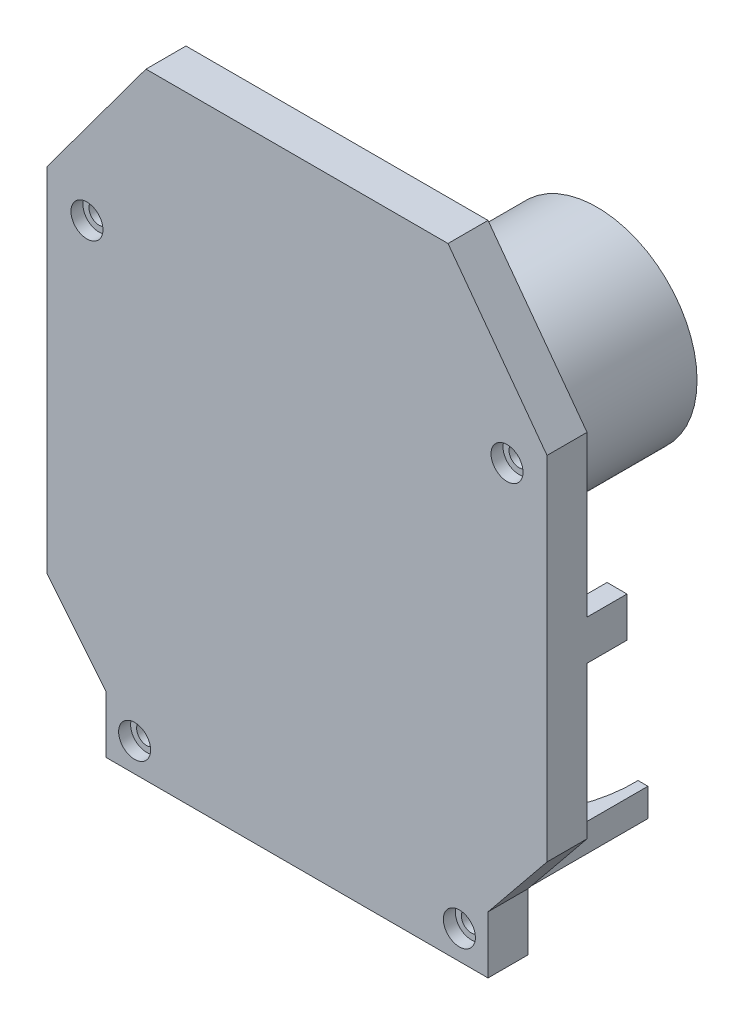
ISO-10303-21;
HEADER;
FILE_DESCRIPTION(('STEP AP214'),'2;1');
FILE_NAME('part.step','',(''),(''),'','','');
FILE_SCHEMA(('AUTOMOTIVE_DESIGN { 1 0 10303 214 1 1 1 1 }'));
ENDSEC;
DATA;
#1=APPLICATION_CONTEXT('core data for automotive mechanical design processes');
#2=APPLICATION_PROTOCOL_DEFINITION('international standard','automotive_design',2000,#1);
#3=PRODUCT_CONTEXT('',#1,'mechanical');
#4=PRODUCT('Part','Part','',(#3));
#5=PRODUCT_RELATED_PRODUCT_CATEGORY('part','',(#4));
#6=PRODUCT_DEFINITION_FORMATION('','',#4);
#7=PRODUCT_DEFINITION_CONTEXT('part definition',#1,'design');
#8=PRODUCT_DEFINITION('design','',#6,#7);
#9=PRODUCT_DEFINITION_SHAPE('','',#8);
#10=(LENGTH_UNIT() NAMED_UNIT(*) SI_UNIT(.MILLI.,.METRE.));
#11=(NAMED_UNIT(*) PLANE_ANGLE_UNIT() SI_UNIT($,.RADIAN.));
#12=(NAMED_UNIT(*) SI_UNIT($,.STERADIAN.) SOLID_ANGLE_UNIT());
#13=UNCERTAINTY_MEASURE_WITH_UNIT(LENGTH_MEASURE(1.E-05),#10,'distance_accuracy_value','');
#14=(GEOMETRIC_REPRESENTATION_CONTEXT(3) GLOBAL_UNCERTAINTY_ASSIGNED_CONTEXT((#13)) GLOBAL_UNIT_ASSIGNED_CONTEXT((#10,
#11,#12)) REPRESENTATION_CONTEXT('',''));
#15=CARTESIAN_POINT('',(0.,0.,0.));
#16=DIRECTION('',(0.,0.,1.));
#17=DIRECTION('',(1.,0.,0.));
#18=AXIS2_PLACEMENT_3D('',#15,#16,#17);
#19=CARTESIAN_POINT('',(-62.5,-48.,40.));
#20=DIRECTION('',(0.776503226970007,0.630113274344514,0.));
#21=DIRECTION('',(-0.630113274344514,0.776503226970007,0.));
#22=AXIS2_PLACEMENT_3D('',#19,#20,#21);
#23=PLANE('',#22);
#24=DIRECTION('',(0.630113274344514,-0.776503226970008,0.));
#25=VECTOR('',#24,1.);
#26=CARTESIAN_POINT('',(-62.5,-48.,30.));
#27=LINE('',#26,#25);
#28=CARTESIAN_POINT('',(-62.5,-48.,30.));
#29=VERTEX_POINT('',#28);
#30=CARTESIAN_POINT('',(-47.75,-66.1767676767677,30.));
#31=VERTEX_POINT('',#30);
#32=EDGE_CURVE('E1730',#29,#31,#27,.T.);
#33=ORIENTED_EDGE('',*,*,#32,.T.);
#34=DIRECTION('',(0.,0.,-1.));
#35=VECTOR('',#34,1.);
#36=CARTESIAN_POINT('',(-47.75,-66.1767676767677,40.));
#37=LINE('',#36,#35);
#38=CARTESIAN_POINT('',(-47.75,-66.1767676767677,40.));
#39=VERTEX_POINT('',#38);
#40=EDGE_CURVE('E1707',#39,#31,#37,.T.);
#41=ORIENTED_EDGE('',*,*,#40,.F.);
#42=DIRECTION('',(0.630113274344514,-0.776503226970008,0.));
#43=VECTOR('',#42,1.);
#44=CARTESIAN_POINT('',(-62.5,-48.,40.));
#45=LINE('',#44,#43);
#46=CARTESIAN_POINT('',(-62.5,-48.,40.));
#47=VERTEX_POINT('',#46);
#48=EDGE_CURVE('E1706',#47,#39,#45,.T.);
#49=ORIENTED_EDGE('',*,*,#48,.F.);
#50=DIRECTION('',(0.,0.,-1.));
#51=VECTOR('',#50,1.);
#52=CARTESIAN_POINT('',(-62.5,-48.,40.));
#53=LINE('',#52,#51);
#54=EDGE_CURVE('E1741',#47,#29,#53,.T.);
#55=ORIENTED_EDGE('',*,*,#54,.T.);
#56=EDGE_LOOP('',(#33,#41,#49,#55));
#57=FACE_BOUND('',#56,.T.);
#58=ADVANCED_FACE('F1522',(#57),#23,.F.);
#59=CARTESIAN_POINT('',(0.,-78.5,0.));
#60=DIRECTION('',(0.,-1.,0.));
#61=DIRECTION('',(0.,0.,-1.));
#62=AXIS2_PLACEMENT_3D('',#59,#60,#61);
#63=PLANE('',#62);
#64=DIRECTION('',(0.,0.,1.));
#65=VECTOR('',#64,1.);
#66=CARTESIAN_POINT('',(35.2274506838568,-78.5,-12.5));
#67=LINE('',#66,#65);
#68=CARTESIAN_POINT('',(35.2274506838568,-78.5,-12.5));
#69=VERTEX_POINT('',#68);
#70=CARTESIAN_POINT('',(35.2274506838568,-78.5,30.));
#71=VERTEX_POINT('',#70);
#72=EDGE_CURVE('E1788',#69,#71,#67,.T.);
#73=ORIENTED_EDGE('',*,*,#72,.T.);
#74=DIRECTION('',(1.,0.,0.));
#75=VECTOR('',#74,1.);
#76=CARTESIAN_POINT('',(-47.75,-78.5,30.));
#77=LINE('',#76,#75);
#78=CARTESIAN_POINT('',(-35.2274506838568,-78.5,30.));
#79=VERTEX_POINT('',#78);
#80=EDGE_CURVE('E1711',#79,#71,#77,.T.);
#81=ORIENTED_EDGE('',*,*,#80,.F.);
#82=DIRECTION('',(0.,0.,-1.));
#83=VECTOR('',#82,1.);
#84=CARTESIAN_POINT('',(-35.2274506838568,-78.5,30.));
#85=LINE('',#84,#83);
#86=CARTESIAN_POINT('',(-35.2274506838568,-78.5,-12.5));
#87=VERTEX_POINT('',#86);
#88=EDGE_CURVE('E1792',#79,#87,#85,.T.);
#89=ORIENTED_EDGE('',*,*,#88,.T.);
#90=DIRECTION('',(1.,0.,0.));
#91=VECTOR('',#90,1.);
#92=CARTESIAN_POINT('',(-32.75,-78.5,-12.5));
#93=LINE('',#92,#91);
#94=CARTESIAN_POINT('',(-32.75,-78.5,-12.5));
#95=VERTEX_POINT('',#94);
#96=EDGE_CURVE('E1785',#87,#95,#93,.T.);
#97=ORIENTED_EDGE('',*,*,#96,.T.);
#98=CARTESIAN_POINT('',(0.,-78.5,-11.5148148148148));
#99=DIRECTION('',(0.,-1.,0.));
#100=DIRECTION('',(0.,0.,-1.));
#101=AXIS2_PLACEMENT_3D('',#98,#99,#100);
#102=CIRCLE('',#101,32.7648148148148);
#103=CARTESIAN_POINT('',(32.75,-78.5,-12.5));
#104=VERTEX_POINT('',#103);
#105=EDGE_CURVE('E1755',#104,#95,#102,.T.);
#106=ORIENTED_EDGE('',*,*,#105,.F.);
#107=DIRECTION('',(1.,0.,0.));
#108=VECTOR('',#107,1.);
#109=CARTESIAN_POINT('',(35.2274506838568,-78.5,-12.5));
#110=LINE('',#109,#108);
#111=EDGE_CURVE('E1780',#104,#69,#110,.T.);
#112=ORIENTED_EDGE('',*,*,#111,.T.);
#113=EDGE_LOOP('',(#73,#81,#89,#97,#106,#112));
#114=FACE_BOUND('',#113,.T.);
#115=ADVANCED_FACE('F2031',(#114),#63,.T.);
#116=CARTESIAN_POINT('',(0.,0.,-12.5));
#117=DIRECTION('',(0.,0.,1.));
#118=DIRECTION('',(1.,0.,0.));
#119=AXIS2_PLACEMENT_3D('',#116,#117,#118);
#120=PLANE('',#119);
#121=DIRECTION('',(-1.,0.,0.));
#122=VECTOR('',#121,1.);
#123=CARTESIAN_POINT('',(-32.75,-71.5,-12.5));
#124=LINE('',#123,#122);
#125=CARTESIAN_POINT('',(-32.75,-71.5000000000001,-12.5));
#126=VERTEX_POINT('',#125);
#127=CARTESIAN_POINT('',(-35.2274506838568,-71.5,-12.5));
#128=VERTEX_POINT('',#127);
#129=EDGE_CURVE('E1753',#126,#128,#124,.T.);
#130=ORIENTED_EDGE('',*,*,#129,.F.);
#131=DIRECTION('',(0.,-1.,0.));
#132=VECTOR('',#131,1.);
#133=CARTESIAN_POINT('',(-32.75,-68.5,-12.5));
#134=LINE('',#133,#132);
#135=EDGE_CURVE('E1828',#126,#95,#134,.T.);
#136=ORIENTED_EDGE('',*,*,#135,.T.);
#137=ORIENTED_EDGE('',*,*,#96,.F.);
#138=DIRECTION('',(0.,-1.,0.));
#139=VECTOR('',#138,1.);
#140=CARTESIAN_POINT('',(-35.2274506838568,-68.5,-12.5));
#141=LINE('',#140,#139);
#142=EDGE_CURVE('E1831',#128,#87,#141,.T.);
#143=ORIENTED_EDGE('',*,*,#142,.F.);
#144=EDGE_LOOP('',(#130,#136,#137,#143));
#145=FACE_BOUND('',#144,.T.);
#146=ADVANCED_FACE('F2039',(#145),#120,.F.);
#147=DIRECTION('',(-1.,0.,0.));
#148=VECTOR('',#147,1.);
#149=CARTESIAN_POINT('',(35.2274506838568,-71.5,-12.5));
#150=LINE('',#149,#148);
#151=CARTESIAN_POINT('',(35.2274506838568,-71.5,-12.5));
#152=VERTEX_POINT('',#151);
#153=CARTESIAN_POINT('',(32.75,-71.5,-12.5));
#154=VERTEX_POINT('',#153);
#155=EDGE_CURVE('E1547',#152,#154,#150,.T.);
#156=ORIENTED_EDGE('',*,*,#155,.F.);
#157=DIRECTION('',(0.,1.,0.));
#158=VECTOR('',#157,1.);
#159=CARTESIAN_POINT('',(35.2274506838568,-73.5,-12.5));
#160=LINE('',#159,#158);
#161=EDGE_CURVE('E2250',#69,#152,#160,.T.);
#162=ORIENTED_EDGE('',*,*,#161,.F.);
#163=ORIENTED_EDGE('',*,*,#111,.F.);
#164=DIRECTION('',(0.,-1.,0.));
#165=VECTOR('',#164,1.);
#166=CARTESIAN_POINT('',(32.75,-68.5,-12.5));
#167=LINE('',#166,#165);
#168=EDGE_CURVE('E1822',#154,#104,#167,.T.);
#169=ORIENTED_EDGE('',*,*,#168,.F.);
#170=EDGE_LOOP('',(#156,#162,#163,#169));
#171=FACE_BOUND('',#170,.T.);
#172=ADVANCED_FACE('F2082',(#171),#120,.F.);
#173=CARTESIAN_POINT('',(-35.2274506838568,-68.5,30.));
#174=DIRECTION('',(1.,0.,0.));
#175=DIRECTION('',(0.,1.,0.));
#176=AXIS2_PLACEMENT_3D('',#173,#174,#175);
#177=PLANE('',#176);
#178=DIRECTION('',(0.,0.,-1.));
#179=VECTOR('',#178,1.);
#180=CARTESIAN_POINT('',(-35.2274506838568,-71.5,30.));
#181=LINE('',#180,#179);
#182=CARTESIAN_POINT('',(-35.2274506838568,-71.5,30.));
#183=VERTEX_POINT('',#182);
#184=EDGE_CURVE('E1756',#183,#128,#181,.T.);
#185=ORIENTED_EDGE('',*,*,#184,.T.);
#186=ORIENTED_EDGE('',*,*,#142,.T.);
#187=ORIENTED_EDGE('',*,*,#88,.F.);
#188=DIRECTION('',(0.,-1.,0.));
#189=VECTOR('',#188,1.);
#190=CARTESIAN_POINT('',(-35.2274506838568,-68.5,30.));
#191=LINE('',#190,#189);
#192=EDGE_CURVE('E1834',#183,#79,#191,.T.);
#193=ORIENTED_EDGE('',*,*,#192,.F.);
#194=EDGE_LOOP('',(#185,#186,#187,#193));
#195=FACE_BOUND('',#194,.T.);
#196=ADVANCED_FACE('F2079',(#195),#177,.F.);
#197=CARTESIAN_POINT('',(35.2274506838568,-73.5,30.));
#198=DIRECTION('',(-1.,0.,0.));
#199=DIRECTION('',(0.,0.,1.));
#200=AXIS2_PLACEMENT_3D('',#197,#198,#199);
#201=PLANE('',#200);
#202=DIRECTION('',(0.,0.,1.));
#203=VECTOR('',#202,1.);
#204=CARTESIAN_POINT('',(35.2274506838568,-71.5,-12.5));
#205=LINE('',#204,#203);
#206=CARTESIAN_POINT('',(35.2274506838568,-71.5,30.));
#207=VERTEX_POINT('',#206);
#208=EDGE_CURVE('E1768',#152,#207,#205,.T.);
#209=ORIENTED_EDGE('',*,*,#208,.T.);
#210=DIRECTION('',(0.,1.,0.));
#211=VECTOR('',#210,1.);
#212=CARTESIAN_POINT('',(35.2274506838568,-73.5,30.));
#213=LINE('',#212,#211);
#214=EDGE_CURVE('E1865',#71,#207,#213,.T.);
#215=ORIENTED_EDGE('',*,*,#214,.F.);
#216=ORIENTED_EDGE('',*,*,#72,.F.);
#217=ORIENTED_EDGE('',*,*,#161,.T.);
#218=EDGE_LOOP('',(#209,#215,#216,#217));
#219=FACE_BOUND('',#218,.T.);
#220=ADVANCED_FACE('F2052',(#219),#201,.F.);
#221=CARTESIAN_POINT('',(0.,-78.5,-11.5148148148148));
#222=DIRECTION('',(0.,1.,0.));
#223=DIRECTION('',(0.,0.,1.));
#224=AXIS2_PLACEMENT_3D('',#221,#222,#223);
#225=CYLINDRICAL_SURFACE('',#224,32.7648148148148);
#226=ORIENTED_EDGE('',*,*,#135,.F.);
#227=CARTESIAN_POINT('',(0.,-71.5,-11.5148148148148));
#228=DIRECTION('',(0.,1.,0.));
#229=DIRECTION('',(-1.,0.,0.));
#230=AXIS2_PLACEMENT_3D('',#227,#228,#229);
#231=CIRCLE('',#230,32.7648148148148);
#232=EDGE_CURVE('E1747',#126,#154,#231,.T.);
#233=ORIENTED_EDGE('',*,*,#232,.T.);
#234=ORIENTED_EDGE('',*,*,#168,.T.);
#235=ORIENTED_EDGE('',*,*,#105,.T.);
#236=EDGE_LOOP('',(#226,#233,#234,#235));
#237=FACE_BOUND('',#236,.T.);
#238=ADVANCED_FACE('F2028',(#237),#225,.F.);
#239=CARTESIAN_POINT('',(0.,0.,30.));
#240=DIRECTION('',(0.,0.,-1.));
#241=DIRECTION('',(-1.,0.,0.));
#242=AXIS2_PLACEMENT_3D('',#239,#240,#241);
#243=PLANE('',#242);
#244=CARTESIAN_POINT('',(-40.5883838383838,-73.3383838383838,30.));
#245=DIRECTION('',(0.,0.,-1.));
#246=DIRECTION('',(-1.,0.,0.));
#247=AXIS2_PLACEMENT_3D('',#244,#245,#246);
#248=CIRCLE('',#247,2.5);
#249=CARTESIAN_POINT('',(-43.0883838383838,-73.3383838383838,30.));
#250=VERTEX_POINT('',#249);
#251=EDGE_CURVE('E2155',#250,#250,#248,.F.);
#252=ORIENTED_EDGE('',*,*,#251,.T.);
#253=EDGE_LOOP('',(#252));
#254=FACE_BOUND('',#253,.T.);
#255=CARTESIAN_POINT('',(40.5883838383838,-73.3383838383838,30.));
#256=DIRECTION('',(0.,0.,-1.));
#257=DIRECTION('',(-1.,0.,0.));
#258=AXIS2_PLACEMENT_3D('',#255,#256,#257);
#259=CIRCLE('',#258,2.5);
#260=CARTESIAN_POINT('',(38.0883838383838,-73.3383838383838,30.));
#261=VERTEX_POINT('',#260);
#262=EDGE_CURVE('E2161',#261,#261,#259,.F.);
#263=ORIENTED_EDGE('',*,*,#262,.T.);
#264=EDGE_LOOP('',(#263));
#265=FACE_BOUND('',#264,.T.);
#266=DIRECTION('',(0.,-1.,0.));
#267=VECTOR('',#266,1.);
#268=CARTESIAN_POINT('',(-47.75,0.,30.));
#269=LINE('',#268,#267);
#270=CARTESIAN_POINT('',(-47.75,-80.5,30.));
#271=VERTEX_POINT('',#270);
#272=EDGE_CURVE('E1693',#31,#271,#269,.T.);
#273=ORIENTED_EDGE('',*,*,#272,.F.);
#274=ORIENTED_EDGE('',*,*,#32,.F.);
#275=DIRECTION('',(0.,1.,0.));
#276=VECTOR('',#275,1.);
#277=CARTESIAN_POINT('',(-62.5,-40.,30.));
#278=LINE('',#277,#276);
#279=CARTESIAN_POINT('',(-62.5,-10.,30.));
#280=VERTEX_POINT('',#279);
#281=EDGE_CURVE('E1980',#29,#280,#278,.T.);
#282=ORIENTED_EDGE('',*,*,#281,.T.);
#283=DIRECTION('',(1.,0.,0.));
#284=VECTOR('',#283,1.);
#285=CARTESIAN_POINT('',(-62.5,-10.,30.));
#286=LINE('',#285,#284);
#287=CARTESIAN_POINT('',(-57.5,-10.,30.));
#288=VERTEX_POINT('',#287);
#289=EDGE_CURVE('E1847',#280,#288,#286,.T.);
#290=ORIENTED_EDGE('',*,*,#289,.T.);
#291=DIRECTION('',(0.,1.,0.));
#292=VECTOR('',#291,1.);
#293=CARTESIAN_POINT('',(-57.5,-10.,30.));
#294=LINE('',#293,#292);
#295=CARTESIAN_POINT('',(-57.5,0.,30.));
#296=VERTEX_POINT('',#295);
#297=EDGE_CURVE('E1856',#288,#296,#294,.T.);
#298=ORIENTED_EDGE('',*,*,#297,.T.);
#299=DIRECTION('',(1.,0.,0.));
#300=VECTOR('',#299,1.);
#301=CARTESIAN_POINT('',(-62.5,0.,30.));
#302=LINE('',#301,#300);
#303=CARTESIAN_POINT('',(-62.5,0.,30.));
#304=VERTEX_POINT('',#303);
#305=EDGE_CURVE('E1875',#304,#296,#302,.T.);
#306=ORIENTED_EDGE('',*,*,#305,.F.);
#307=CARTESIAN_POINT('',(-62.5,40.,30.));
#308=VERTEX_POINT('',#307);
#309=EDGE_CURVE('E1977',#304,#308,#278,.T.);
#310=ORIENTED_EDGE('',*,*,#309,.T.);
#311=DIRECTION('',(0.594222280707253,0.804300864795675,0.));
#312=VECTOR('',#311,1.);
#313=CARTESIAN_POINT('',(-37.75,73.5,30.));
#314=LINE('',#313,#312);
#315=CARTESIAN_POINT('',(-37.75,73.5,30.));
#316=VERTEX_POINT('',#315);
#317=EDGE_CURVE('E1988',#308,#316,#314,.T.);
#318=ORIENTED_EDGE('',*,*,#317,.T.);
#319=DIRECTION('',(1.,0.,0.));
#320=VECTOR('',#319,1.);
#321=CARTESIAN_POINT('',(-37.75,73.5,30.));
#322=LINE('',#321,#320);
#323=CARTESIAN_POINT('',(37.75,73.5,30.));
#324=VERTEX_POINT('',#323);
#325=EDGE_CURVE('E1947',#316,#324,#322,.T.);
#326=ORIENTED_EDGE('',*,*,#325,.T.);
#327=DIRECTION('',(0.594222280707253,-0.804300864795675,0.));
#328=VECTOR('',#327,1.);
#329=CARTESIAN_POINT('',(37.75,73.5,30.));
#330=LINE('',#329,#328);
#331=CARTESIAN_POINT('',(62.5,40.,30.));
#332=VERTEX_POINT('',#331);
#333=EDGE_CURVE('E1955',#324,#332,#330,.T.);
#334=ORIENTED_EDGE('',*,*,#333,.T.);
#335=DIRECTION('',(0.,-1.,0.));
#336=VECTOR('',#335,1.);
#337=CARTESIAN_POINT('',(62.5,-40.,30.));
#338=LINE('',#337,#336);
#339=CARTESIAN_POINT('',(62.5,0.,30.));
#340=VERTEX_POINT('',#339);
#341=EDGE_CURVE('E1968',#332,#340,#338,.T.);
#342=ORIENTED_EDGE('',*,*,#341,.T.);
#343=DIRECTION('',(-1.,0.,0.));
#344=VECTOR('',#343,1.);
#345=CARTESIAN_POINT('',(62.5,0.,30.));
#346=LINE('',#345,#344);
#347=CARTESIAN_POINT('',(57.5,0.,30.));
#348=VERTEX_POINT('',#347);
#349=EDGE_CURVE('E1898',#340,#348,#346,.T.);
#350=ORIENTED_EDGE('',*,*,#349,.T.);
#351=DIRECTION('',(0.,1.,0.));
#352=VECTOR('',#351,1.);
#353=CARTESIAN_POINT('',(57.5,-10.,30.));
#354=LINE('',#353,#352);
#355=CARTESIAN_POINT('',(57.5,-10.,30.));
#356=VERTEX_POINT('',#355);
#357=EDGE_CURVE('E1907',#356,#348,#354,.T.);
#358=ORIENTED_EDGE('',*,*,#357,.F.);
#359=DIRECTION('',(-1.,0.,0.));
#360=VECTOR('',#359,1.);
#361=CARTESIAN_POINT('',(62.5,-10.,30.));
#362=LINE('',#361,#360);
#363=CARTESIAN_POINT('',(62.5,-10.,30.));
#364=VERTEX_POINT('',#363);
#365=EDGE_CURVE('E1928',#364,#356,#362,.T.);
#366=ORIENTED_EDGE('',*,*,#365,.F.);
#367=CARTESIAN_POINT('',(62.5,-48.,30.));
#368=VERTEX_POINT('',#367);
#369=EDGE_CURVE('E1964',#364,#368,#338,.T.);
#370=ORIENTED_EDGE('',*,*,#369,.T.);
#371=DIRECTION('',(-0.630113274344514,-0.776503226970008,0.));
#372=VECTOR('',#371,1.);
#373=CARTESIAN_POINT('',(62.5,-48.,30.));
#374=LINE('',#373,#372);
#375=CARTESIAN_POINT('',(47.75,-66.1767676767677,30.));
#376=VERTEX_POINT('',#375);
#377=EDGE_CURVE('E1715',#368,#376,#374,.T.);
#378=ORIENTED_EDGE('',*,*,#377,.T.);
#379=DIRECTION('',(0.,1.,0.));
#380=VECTOR('',#379,1.);
#381=CARTESIAN_POINT('',(47.75,0.,30.));
#382=LINE('',#381,#380);
#383=CARTESIAN_POINT('',(47.75,-80.5,30.));
#384=VERTEX_POINT('',#383);
#385=EDGE_CURVE('E1698',#384,#376,#382,.T.);
#386=ORIENTED_EDGE('',*,*,#385,.F.);
#387=DIRECTION('',(-1.,0.,0.));
#388=VECTOR('',#387,1.);
#389=CARTESIAN_POINT('',(49.75,-80.5,30.));
#390=LINE('',#389,#388);
#391=EDGE_CURVE('E1712',#384,#271,#390,.T.);
#392=ORIENTED_EDGE('',*,*,#391,.T.);
#393=EDGE_LOOP('',(#273,#274,#282,#290,#298,#306,#310,#318,#326,#334,#342,#350,#358,#366,#370,
#378,#386,#392));
#394=FACE_BOUND('',#393,.T.);
#395=ORIENTED_EDGE('',*,*,#192,.T.);
#396=ORIENTED_EDGE('',*,*,#80,.T.);
#397=ORIENTED_EDGE('',*,*,#214,.T.);
#398=DIRECTION('',(-1.,0.,0.));
#399=VECTOR('',#398,1.);
#400=CARTESIAN_POINT('',(35.2274506838568,-71.5,30.));
#401=LINE('',#400,#399);
#402=EDGE_CURVE('E1764',#207,#183,#401,.T.);
#403=ORIENTED_EDGE('',*,*,#402,.T.);
#404=EDGE_LOOP('',(#395,#396,#397,#403));
#405=FACE_BOUND('',#404,.T.);
#406=CARTESIAN_POINT('',(52.4999999999999,33.3533170872406,30.));
#407=DIRECTION('',(0.,0.,-1.));
#408=DIRECTION('',(-1.,0.,0.));
#409=AXIS2_PLACEMENT_3D('',#406,#407,#408);
#410=CIRCLE('',#409,2.5);
#411=CARTESIAN_POINT('',(49.9999999999999,33.3533170872406,30.));
#412=VERTEX_POINT('',#411);
#413=EDGE_CURVE('E1818',#412,#412,#410,.F.);
#414=ORIENTED_EDGE('',*,*,#413,.T.);
#415=EDGE_LOOP('',(#414));
#416=FACE_BOUND('',#415,.T.);
#417=CARTESIAN_POINT('',(-52.5,33.3533170872405,30.));
#418=DIRECTION('',(0.,0.,-1.));
#419=DIRECTION('',(-1.,0.,0.));
#420=AXIS2_PLACEMENT_3D('',#417,#418,#419);
#421=CIRCLE('',#420,2.5);
#422=CARTESIAN_POINT('',(-55.,33.3533170872405,30.));
#423=VERTEX_POINT('',#422);
#424=EDGE_CURVE('E1815',#423,#423,#421,.F.);
#425=ORIENTED_EDGE('',*,*,#424,.T.);
#426=EDGE_LOOP('',(#425));
#427=FACE_BOUND('',#426,.T.);
#428=CARTESIAN_POINT('',(0.,0.,30.));
#429=DIRECTION('',(0.,0.,1.));
#430=DIRECTION('',(1.,0.,0.));
#431=AXIS2_PLACEMENT_3D('',#428,#429,#430);
#432=CIRCLE('',#431,25.);
#433=CARTESIAN_POINT('',(25.,0.,30.));
#434=VERTEX_POINT('',#433);
#435=EDGE_CURVE('E14',#434,#434,#432,.T.);
#436=ORIENTED_EDGE('',*,*,#435,.T.);
#437=EDGE_LOOP('',(#436));
#438=FACE_BOUND('',#437,.T.);
#439=ADVANCED_FACE('F2014',(#254,#265,#394,#405,#416,#427,#438),#243,.T.);
#440=CARTESIAN_POINT('',(0.,0.,-55.));
#441=DIRECTION('',(0.,0.,1.));
#442=DIRECTION('',(1.,0.,0.));
#443=AXIS2_PLACEMENT_3D('',#440,#441,#442);
#444=CYLINDRICAL_SURFACE('',#443,25.);
#445=CARTESIAN_POINT('',(0.,0.,-35.));
#446=DIRECTION('',(0.,0.,1.));
#447=DIRECTION('',(1.,0.,0.));
#448=AXIS2_PLACEMENT_3D('',#445,#446,#447);
#449=CIRCLE('',#448,25.);
#450=CARTESIAN_POINT('',(25.,0.,-35.));
#451=VERTEX_POINT('',#450);
#452=EDGE_CURVE('E2148',#451,#451,#449,.T.);
#453=ORIENTED_EDGE('',*,*,#452,.T.);
#454=EDGE_LOOP('',(#453));
#455=FACE_BOUND('',#454,.T.);
#456=ORIENTED_EDGE('',*,*,#435,.F.);
#457=EDGE_LOOP('',(#456));
#458=FACE_BOUND('',#457,.T.);
#459=ADVANCED_FACE('F1524',(#455,#458),#444,.T.);
#460=CARTESIAN_POINT('',(0.,0.,40.));
#461=DIRECTION('',(0.,0.,-1.));
#462=DIRECTION('',(-1.,0.,0.));
#463=AXIS2_PLACEMENT_3D('',#460,#461,#462);
#464=PLANE('',#463);
#465=CARTESIAN_POINT('',(-40.5883838383838,-73.3383838383838,40.));
#466=DIRECTION('',(0.,0.,1.));
#467=DIRECTION('',(1.,0.,0.));
#468=AXIS2_PLACEMENT_3D('',#465,#466,#467);
#469=CIRCLE('',#468,4.);
#470=CARTESIAN_POINT('',(-36.5883838383838,-73.3383838383838,40.));
#471=VERTEX_POINT('',#470);
#472=EDGE_CURVE('E2165',#471,#471,#469,.T.);
#473=ORIENTED_EDGE('',*,*,#472,.F.);
#474=EDGE_LOOP('',(#473));
#475=FACE_BOUND('',#474,.T.);
#476=CARTESIAN_POINT('',(40.5883838383838,-73.3383838383838,40.));
#477=DIRECTION('',(0.,0.,1.));
#478=DIRECTION('',(1.,0.,0.));
#479=AXIS2_PLACEMENT_3D('',#476,#477,#478);
#480=CIRCLE('',#479,4.);
#481=CARTESIAN_POINT('',(44.5883838383838,-73.3383838383838,40.));
#482=VERTEX_POINT('',#481);
#483=EDGE_CURVE('E2164',#482,#482,#480,.T.);
#484=ORIENTED_EDGE('',*,*,#483,.F.);
#485=EDGE_LOOP('',(#484));
#486=FACE_BOUND('',#485,.T.);
#487=ORIENTED_EDGE('',*,*,#48,.T.);
#488=DIRECTION('',(0.,-1.,0.));
#489=VECTOR('',#488,1.);
#490=CARTESIAN_POINT('',(-47.75,-66.1767676767677,40.));
#491=LINE('',#490,#489);
#492=CARTESIAN_POINT('',(-47.75,-80.5,40.));
#493=VERTEX_POINT('',#492);
#494=EDGE_CURVE('E1690',#39,#493,#491,.T.);
#495=ORIENTED_EDGE('',*,*,#494,.T.);
#496=DIRECTION('',(-1.,0.,0.));
#497=VECTOR('',#496,1.);
#498=CARTESIAN_POINT('',(49.75,-80.5,40.));
#499=LINE('',#498,#497);
#500=CARTESIAN_POINT('',(47.75,-80.5,40.));
#501=VERTEX_POINT('',#500);
#502=EDGE_CURVE('E1704',#501,#493,#499,.T.);
#503=ORIENTED_EDGE('',*,*,#502,.F.);
#504=DIRECTION('',(0.,1.,0.));
#505=VECTOR('',#504,1.);
#506=CARTESIAN_POINT('',(47.75,-80.5,40.));
#507=LINE('',#506,#505);
#508=CARTESIAN_POINT('',(47.75,-66.1767676767677,40.));
#509=VERTEX_POINT('',#508);
#510=EDGE_CURVE('E1539',#501,#509,#507,.T.);
#511=ORIENTED_EDGE('',*,*,#510,.T.);
#512=DIRECTION('',(-0.630113274344514,-0.776503226970008,0.));
#513=VECTOR('',#512,1.);
#514=CARTESIAN_POINT('',(62.5,-48.,40.));
#515=LINE('',#514,#513);
#516=CARTESIAN_POINT('',(62.5,-48.,40.));
#517=VERTEX_POINT('',#516);
#518=EDGE_CURVE('E1728',#517,#509,#515,.T.);
#519=ORIENTED_EDGE('',*,*,#518,.F.);
#520=DIRECTION('',(0.,-1.,0.));
#521=VECTOR('',#520,1.);
#522=CARTESIAN_POINT('',(62.5,-40.,40.));
#523=LINE('',#522,#521);
#524=CARTESIAN_POINT('',(62.5,40.,40.));
#525=VERTEX_POINT('',#524);
#526=EDGE_CURVE('E1965',#525,#517,#523,.T.);
#527=ORIENTED_EDGE('',*,*,#526,.F.);
#528=DIRECTION('',(0.594222280707253,-0.804300864795675,0.));
#529=VECTOR('',#528,1.);
#530=CARTESIAN_POINT('',(37.75,73.5,40.));
#531=LINE('',#530,#529);
#532=CARTESIAN_POINT('',(37.75,73.5,40.));
#533=VERTEX_POINT('',#532);
#534=EDGE_CURVE('E1958',#533,#525,#531,.T.);
#535=ORIENTED_EDGE('',*,*,#534,.F.);
#536=DIRECTION('',(1.,0.,0.));
#537=VECTOR('',#536,1.);
#538=CARTESIAN_POINT('',(-37.75,73.5,40.));
#539=LINE('',#538,#537);
#540=CARTESIAN_POINT('',(-37.75,73.5,40.));
#541=VERTEX_POINT('',#540);
#542=EDGE_CURVE('E1900',#541,#533,#539,.T.);
#543=ORIENTED_EDGE('',*,*,#542,.F.);
#544=DIRECTION('',(0.594222280707253,0.804300864795675,0.));
#545=VECTOR('',#544,1.);
#546=CARTESIAN_POINT('',(-37.75,73.5,40.));
#547=LINE('',#546,#545);
#548=CARTESIAN_POINT('',(-62.5,40.,40.));
#549=VERTEX_POINT('',#548);
#550=EDGE_CURVE('E1946',#549,#541,#547,.T.);
#551=ORIENTED_EDGE('',*,*,#550,.F.);
#552=DIRECTION('',(0.,1.,0.));
#553=VECTOR('',#552,1.);
#554=CARTESIAN_POINT('',(-62.5,-40.,40.));
#555=LINE('',#554,#553);
#556=EDGE_CURVE('E1981',#47,#549,#555,.T.);
#557=ORIENTED_EDGE('',*,*,#556,.F.);
#558=EDGE_LOOP('',(#487,#495,#503,#511,#519,#527,#535,#543,#551,#557));
#559=FACE_BOUND('',#558,.T.);
#560=CARTESIAN_POINT('',(-52.5,33.3533170872405,40.));
#561=DIRECTION('',(0.,0.,1.));
#562=DIRECTION('',(1.,0.,0.));
#563=AXIS2_PLACEMENT_3D('',#560,#561,#562);
#564=CIRCLE('',#563,4.00000000000001);
#565=CARTESIAN_POINT('',(-48.4999999999999,33.3533170872405,40.));
#566=VERTEX_POINT('',#565);
#567=EDGE_CURVE('E1808',#566,#566,#564,.T.);
#568=ORIENTED_EDGE('',*,*,#567,.F.);
#569=EDGE_LOOP('',(#568));
#570=FACE_BOUND('',#569,.T.);
#571=CARTESIAN_POINT('',(52.5,33.3533170872405,40.));
#572=DIRECTION('',(0.,0.,1.));
#573=DIRECTION('',(1.,0.,0.));
#574=AXIS2_PLACEMENT_3D('',#571,#572,#573);
#575=CIRCLE('',#574,4.00000000000001);
#576=CARTESIAN_POINT('',(56.5,33.3533170872405,40.));
#577=VERTEX_POINT('',#576);
#578=EDGE_CURVE('E1791',#577,#577,#575,.T.);
#579=ORIENTED_EDGE('',*,*,#578,.F.);
#580=EDGE_LOOP('',(#579));
#581=FACE_BOUND('',#580,.T.);
#582=ADVANCED_FACE('F1702',(#475,#486,#559,#570,#581),#464,.F.);
#583=CARTESIAN_POINT('',(-37.75,73.5,30.));
#584=DIRECTION('',(0.,-1.,0.));
#585=DIRECTION('',(0.,0.,-1.));
#586=AXIS2_PLACEMENT_3D('',#583,#584,#585);
#587=PLANE('',#586);
#588=ORIENTED_EDGE('',*,*,#542,.T.);
#589=DIRECTION('',(0.,0.,1.));
#590=VECTOR('',#589,1.);
#591=CARTESIAN_POINT('',(37.75,73.5,30.));
#592=LINE('',#591,#590);
#593=EDGE_CURVE('E1943',#324,#533,#592,.T.);
#594=ORIENTED_EDGE('',*,*,#593,.F.);
#595=ORIENTED_EDGE('',*,*,#325,.F.);
#596=DIRECTION('',(0.,0.,1.));
#597=VECTOR('',#596,1.);
#598=CARTESIAN_POINT('',(-37.75,73.5,30.));
#599=LINE('',#598,#597);
#600=EDGE_CURVE('E1952',#316,#541,#599,.T.);
#601=ORIENTED_EDGE('',*,*,#600,.T.);
#602=EDGE_LOOP('',(#588,#594,#595,#601));
#603=FACE_BOUND('',#602,.T.);
#604=ADVANCED_FACE('F2120',(#603),#587,.F.);
#605=CARTESIAN_POINT('',(-37.75,73.5,30.));
#606=DIRECTION('',(0.804300864795675,-0.594222280707253,0.));
#607=DIRECTION('',(0.594222280707253,0.804300864795675,0.));
#608=AXIS2_PLACEMENT_3D('',#605,#606,#607);
#609=PLANE('',#608);
#610=ORIENTED_EDGE('',*,*,#550,.T.);
#611=ORIENTED_EDGE('',*,*,#600,.F.);
#612=ORIENTED_EDGE('',*,*,#317,.F.);
#613=DIRECTION('',(0.,0.,1.));
#614=VECTOR('',#613,1.);
#615=CARTESIAN_POINT('',(-62.5,40.,30.));
#616=LINE('',#615,#614);
#617=EDGE_CURVE('E1991',#308,#549,#616,.T.);
#618=ORIENTED_EDGE('',*,*,#617,.T.);
#619=EDGE_LOOP('',(#610,#611,#612,#618));
#620=FACE_BOUND('',#619,.T.);
#621=ADVANCED_FACE('F2122',(#620),#609,.F.);
#622=CARTESIAN_POINT('',(-62.5,-40.,30.));
#623=DIRECTION('',(1.,0.,0.));
#624=DIRECTION('',(0.,0.,-1.));
#625=AXIS2_PLACEMENT_3D('',#622,#623,#624);
#626=PLANE('',#625);
#627=ORIENTED_EDGE('',*,*,#556,.T.);
#628=ORIENTED_EDGE('',*,*,#617,.F.);
#629=ORIENTED_EDGE('',*,*,#309,.F.);
#630=DIRECTION('',(0.,0.,-1.));
#631=VECTOR('',#630,1.);
#632=CARTESIAN_POINT('',(-62.5,0.,30.));
#633=LINE('',#632,#631);
#634=CARTESIAN_POINT('',(-62.5,0.,20.));
#635=VERTEX_POINT('',#634);
#636=EDGE_CURVE('E1844',#304,#635,#633,.T.);
#637=ORIENTED_EDGE('',*,*,#636,.T.);
#638=DIRECTION('',(0.,-1.,0.));
#639=VECTOR('',#638,1.);
#640=CARTESIAN_POINT('',(-62.5,0.,20.));
#641=LINE('',#640,#639);
#642=CARTESIAN_POINT('',(-62.5,-10.,20.));
#643=VERTEX_POINT('',#642);
#644=EDGE_CURVE('E1863',#635,#643,#641,.T.);
#645=ORIENTED_EDGE('',*,*,#644,.T.);
#646=DIRECTION('',(0.,0.,-1.));
#647=VECTOR('',#646,1.);
#648=CARTESIAN_POINT('',(-62.5,-10.,30.));
#649=LINE('',#648,#647);
#650=EDGE_CURVE('E1840',#280,#643,#649,.T.);
#651=ORIENTED_EDGE('',*,*,#650,.F.);
#652=ORIENTED_EDGE('',*,*,#281,.F.);
#653=ORIENTED_EDGE('',*,*,#54,.F.);
#654=EDGE_LOOP('',(#627,#628,#629,#637,#645,#651,#652,#653));
#655=FACE_BOUND('',#654,.T.);
#656=ADVANCED_FACE('F2126',(#655),#626,.F.);
#657=CARTESIAN_POINT('',(62.5,-40.,30.));
#658=DIRECTION('',(-1.,0.,0.));
#659=DIRECTION('',(0.,0.,1.));
#660=AXIS2_PLACEMENT_3D('',#657,#658,#659);
#661=PLANE('',#660);
#662=ORIENTED_EDGE('',*,*,#526,.T.);
#663=DIRECTION('',(0.,0.,-1.));
#664=VECTOR('',#663,1.);
#665=CARTESIAN_POINT('',(62.5,-48.,40.));
#666=LINE('',#665,#664);
#667=EDGE_CURVE('E1731',#517,#368,#666,.T.);
#668=ORIENTED_EDGE('',*,*,#667,.T.);
#669=ORIENTED_EDGE('',*,*,#369,.F.);
#670=DIRECTION('',(0.,0.,-1.));
#671=VECTOR('',#670,1.);
#672=CARTESIAN_POINT('',(62.5,-10.,30.));
#673=LINE('',#672,#671);
#674=CARTESIAN_POINT('',(62.5,-10.,20.));
#675=VERTEX_POINT('',#674);
#676=EDGE_CURVE('E1895',#364,#675,#673,.T.);
#677=ORIENTED_EDGE('',*,*,#676,.T.);
#678=DIRECTION('',(0.,-1.,0.));
#679=VECTOR('',#678,1.);
#680=CARTESIAN_POINT('',(62.5,0.,20.));
#681=LINE('',#680,#679);
#682=CARTESIAN_POINT('',(62.5,0.,20.));
#683=VERTEX_POINT('',#682);
#684=EDGE_CURVE('E1849',#683,#675,#681,.T.);
#685=ORIENTED_EDGE('',*,*,#684,.F.);
#686=DIRECTION('',(0.,0.,-1.));
#687=VECTOR('',#686,1.);
#688=CARTESIAN_POINT('',(62.5,0.,30.));
#689=LINE('',#688,#687);
#690=EDGE_CURVE('E1892',#340,#683,#689,.T.);
#691=ORIENTED_EDGE('',*,*,#690,.F.);
#692=ORIENTED_EDGE('',*,*,#341,.F.);
#693=DIRECTION('',(0.,0.,1.));
#694=VECTOR('',#693,1.);
#695=CARTESIAN_POINT('',(62.5,40.,30.));
#696=LINE('',#695,#694);
#697=EDGE_CURVE('E1961',#332,#525,#696,.T.);
#698=ORIENTED_EDGE('',*,*,#697,.T.);
#699=EDGE_LOOP('',(#662,#668,#669,#677,#685,#691,#692,#698));
#700=FACE_BOUND('',#699,.T.);
#701=ADVANCED_FACE('F2130',(#700),#661,.F.);
#702=CARTESIAN_POINT('',(37.75,73.5,30.));
#703=DIRECTION('',(-0.804300864795675,-0.594222280707253,0.));
#704=DIRECTION('',(0.594222280707253,-0.804300864795675,0.));
#705=AXIS2_PLACEMENT_3D('',#702,#703,#704);
#706=PLANE('',#705);
#707=ORIENTED_EDGE('',*,*,#534,.T.);
#708=ORIENTED_EDGE('',*,*,#697,.F.);
#709=ORIENTED_EDGE('',*,*,#333,.F.);
#710=ORIENTED_EDGE('',*,*,#593,.T.);
#711=EDGE_LOOP('',(#707,#708,#709,#710));
#712=FACE_BOUND('',#711,.T.);
#713=ADVANCED_FACE('F2118',(#712),#706,.F.);
#714=CARTESIAN_POINT('',(1.68865667709635E-13,0.,20.0000000000003));
#715=DIRECTION('',(0.,0.,1.));
#716=DIRECTION('',(1.,0.,0.));
#717=AXIS2_PLACEMENT_3D('',#714,#715,#716);
#718=PLANE('',#717);
#719=ORIENTED_EDGE('',*,*,#684,.T.);
#720=DIRECTION('',(-1.,0.,0.));
#721=VECTOR('',#720,1.);
#722=CARTESIAN_POINT('',(62.5,-10.,20.));
#723=LINE('',#722,#721);
#724=CARTESIAN_POINT('',(57.5,-10.,20.));
#725=VERTEX_POINT('',#724);
#726=EDGE_CURVE('E1933',#675,#725,#723,.T.);
#727=ORIENTED_EDGE('',*,*,#726,.T.);
#728=DIRECTION('',(0.,1.,0.));
#729=VECTOR('',#728,1.);
#730=CARTESIAN_POINT('',(57.5,-10.,20.));
#731=LINE('',#730,#729);
#732=CARTESIAN_POINT('',(57.5,0.,20.));
#733=VERTEX_POINT('',#732);
#734=EDGE_CURVE('E1912',#725,#733,#731,.T.);
#735=ORIENTED_EDGE('',*,*,#734,.T.);
#736=DIRECTION('',(-1.,0.,0.));
#737=VECTOR('',#736,1.);
#738=CARTESIAN_POINT('',(62.5,0.,20.));
#739=LINE('',#738,#737);
#740=EDGE_CURVE('E1901',#683,#733,#739,.T.);
#741=ORIENTED_EDGE('',*,*,#740,.F.);
#742=EDGE_LOOP('',(#719,#727,#735,#741));
#743=FACE_BOUND('',#742,.T.);
#744=ADVANCED_FACE('F2093',(#743),#718,.F.);
#745=CARTESIAN_POINT('',(62.5,-10.,30.));
#746=DIRECTION('',(0.,-1.,0.));
#747=DIRECTION('',(1.,0.,0.));
#748=AXIS2_PLACEMENT_3D('',#745,#746,#747);
#749=PLANE('',#748);
#750=ORIENTED_EDGE('',*,*,#726,.F.);
#751=ORIENTED_EDGE('',*,*,#676,.F.);
#752=ORIENTED_EDGE('',*,*,#365,.T.);
#753=DIRECTION('',(0.,0.,-1.));
#754=VECTOR('',#753,1.);
#755=CARTESIAN_POINT('',(57.5,-10.,30.));
#756=LINE('',#755,#754);
#757=EDGE_CURVE('E1923',#356,#725,#756,.T.);
#758=ORIENTED_EDGE('',*,*,#757,.T.);
#759=EDGE_LOOP('',(#750,#751,#752,#758));
#760=FACE_BOUND('',#759,.T.);
#761=ADVANCED_FACE('F2105',(#760),#749,.T.);
#762=CARTESIAN_POINT('',(57.5,-10.,30.));
#763=DIRECTION('',(-1.,0.,0.));
#764=DIRECTION('',(0.,0.,1.));
#765=AXIS2_PLACEMENT_3D('',#762,#763,#764);
#766=PLANE('',#765);
#767=ORIENTED_EDGE('',*,*,#734,.F.);
#768=ORIENTED_EDGE('',*,*,#757,.F.);
#769=ORIENTED_EDGE('',*,*,#357,.T.);
#770=DIRECTION('',(0.,0.,-1.));
#771=VECTOR('',#770,1.);
#772=CARTESIAN_POINT('',(57.5,0.,30.));
#773=LINE('',#772,#771);
#774=EDGE_CURVE('E1904',#348,#733,#773,.T.);
#775=ORIENTED_EDGE('',*,*,#774,.T.);
#776=EDGE_LOOP('',(#767,#768,#769,#775));
#777=FACE_BOUND('',#776,.T.);
#778=ADVANCED_FACE('F2108',(#777),#766,.T.);
#779=CARTESIAN_POINT('',(62.5,0.,30.));
#780=DIRECTION('',(0.,-1.,0.));
#781=DIRECTION('',(1.,0.,0.));
#782=AXIS2_PLACEMENT_3D('',#779,#780,#781);
#783=PLANE('',#782);
#784=ORIENTED_EDGE('',*,*,#740,.T.);
#785=ORIENTED_EDGE('',*,*,#774,.F.);
#786=ORIENTED_EDGE('',*,*,#349,.F.);
#787=ORIENTED_EDGE('',*,*,#690,.T.);
#788=EDGE_LOOP('',(#784,#785,#786,#787));
#789=FACE_BOUND('',#788,.T.);
#790=ADVANCED_FACE('F2103',(#789),#783,.F.);
#791=CARTESIAN_POINT('',(-1.26649250782226E-13,0.,20.0000000000003));
#792=DIRECTION('',(0.,0.,1.));
#793=DIRECTION('',(1.,0.,0.));
#794=AXIS2_PLACEMENT_3D('',#791,#792,#793);
#795=PLANE('',#794);
#796=ORIENTED_EDGE('',*,*,#644,.F.);
#797=DIRECTION('',(1.,0.,0.));
#798=VECTOR('',#797,1.);
#799=CARTESIAN_POINT('',(-62.5,0.,20.));
#800=LINE('',#799,#798);
#801=CARTESIAN_POINT('',(-57.5,0.,20.));
#802=VERTEX_POINT('',#801);
#803=EDGE_CURVE('E1843',#635,#802,#800,.T.);
#804=ORIENTED_EDGE('',*,*,#803,.T.);
#805=DIRECTION('',(0.,1.,0.));
#806=VECTOR('',#805,1.);
#807=CARTESIAN_POINT('',(-57.5,-10.,20.));
#808=LINE('',#807,#806);
#809=CARTESIAN_POINT('',(-57.5,-10.,20.));
#810=VERTEX_POINT('',#809);
#811=EDGE_CURVE('E1857',#810,#802,#808,.T.);
#812=ORIENTED_EDGE('',*,*,#811,.F.);
#813=DIRECTION('',(1.,0.,0.));
#814=VECTOR('',#813,1.);
#815=CARTESIAN_POINT('',(-62.5,-10.,20.));
#816=LINE('',#815,#814);
#817=EDGE_CURVE('E1850',#643,#810,#816,.T.);
#818=ORIENTED_EDGE('',*,*,#817,.F.);
#819=EDGE_LOOP('',(#796,#804,#812,#818));
#820=FACE_BOUND('',#819,.T.);
#821=ADVANCED_FACE('F2078',(#820),#795,.F.);
#822=CARTESIAN_POINT('',(-57.5,-10.,30.));
#823=DIRECTION('',(-1.,0.,0.));
#824=DIRECTION('',(0.,0.,1.));
#825=AXIS2_PLACEMENT_3D('',#822,#823,#824);
#826=PLANE('',#825);
#827=ORIENTED_EDGE('',*,*,#811,.T.);
#828=DIRECTION('',(0.,0.,-1.));
#829=VECTOR('',#828,1.);
#830=CARTESIAN_POINT('',(-57.5,0.,30.));
#831=LINE('',#830,#829);
#832=EDGE_CURVE('E1872',#296,#802,#831,.T.);
#833=ORIENTED_EDGE('',*,*,#832,.F.);
#834=ORIENTED_EDGE('',*,*,#297,.F.);
#835=DIRECTION('',(0.,0.,-1.));
#836=VECTOR('',#835,1.);
#837=CARTESIAN_POINT('',(-57.5,-10.,30.));
#838=LINE('',#837,#836);
#839=EDGE_CURVE('E1853',#288,#810,#838,.T.);
#840=ORIENTED_EDGE('',*,*,#839,.T.);
#841=EDGE_LOOP('',(#827,#833,#834,#840));
#842=FACE_BOUND('',#841,.T.);
#843=ADVANCED_FACE('F2094',(#842),#826,.F.);
#844=CARTESIAN_POINT('',(-62.5,-10.,30.));
#845=DIRECTION('',(0.,1.,0.));
#846=DIRECTION('',(-1.,0.,0.));
#847=AXIS2_PLACEMENT_3D('',#844,#845,#846);
#848=PLANE('',#847);
#849=ORIENTED_EDGE('',*,*,#817,.T.);
#850=ORIENTED_EDGE('',*,*,#839,.F.);
#851=ORIENTED_EDGE('',*,*,#289,.F.);
#852=ORIENTED_EDGE('',*,*,#650,.T.);
#853=EDGE_LOOP('',(#849,#850,#851,#852));
#854=FACE_BOUND('',#853,.T.);
#855=ADVANCED_FACE('F2091',(#854),#848,.F.);
#856=CARTESIAN_POINT('',(-62.5,0.,30.));
#857=DIRECTION('',(0.,1.,0.));
#858=DIRECTION('',(-1.,0.,0.));
#859=AXIS2_PLACEMENT_3D('',#856,#857,#858);
#860=PLANE('',#859);
#861=ORIENTED_EDGE('',*,*,#803,.F.);
#862=ORIENTED_EDGE('',*,*,#636,.F.);
#863=ORIENTED_EDGE('',*,*,#305,.T.);
#864=ORIENTED_EDGE('',*,*,#832,.T.);
#865=EDGE_LOOP('',(#861,#862,#863,#864));
#866=FACE_BOUND('',#865,.T.);
#867=ADVANCED_FACE('F2076',(#866),#860,.T.);
#868=CARTESIAN_POINT('',(-52.5,33.3533170872405,40.));
#869=DIRECTION('',(0.,0.,-1.));
#870=DIRECTION('',(-1.,0.,0.));
#871=AXIS2_PLACEMENT_3D('',#868,#869,#870);
#872=CYLINDRICAL_SURFACE('',#871,2.5);
#873=CARTESIAN_POINT('',(-52.5,33.3533170872405,37.));
#874=DIRECTION('',(0.,0.,-1.));
#875=DIRECTION('',(-1.,0.,0.));
#876=AXIS2_PLACEMENT_3D('',#873,#874,#875);
#877=CIRCLE('',#876,2.5);
#878=CARTESIAN_POINT('',(-55.,33.3533170872405,37.));
#879=VERTEX_POINT('',#878);
#880=EDGE_CURVE('E1819',#879,#879,#877,.T.);
#881=ORIENTED_EDGE('',*,*,#880,.F.);
#882=EDGE_LOOP('',(#881));
#883=FACE_BOUND('',#882,.T.);
#884=ORIENTED_EDGE('',*,*,#424,.F.);
#885=EDGE_LOOP('',(#884));
#886=FACE_BOUND('',#885,.T.);
#887=ADVANCED_FACE('F2072',(#883,#886),#872,.F.);
#888=CARTESIAN_POINT('',(52.4999999999999,33.3533170872406,40.));
#889=DIRECTION('',(0.,0.,-1.));
#890=DIRECTION('',(-1.,0.,0.));
#891=AXIS2_PLACEMENT_3D('',#888,#889,#890);
#892=CYLINDRICAL_SURFACE('',#891,2.5);
#893=CARTESIAN_POINT('',(52.4999999999999,33.3533170872406,37.));
#894=DIRECTION('',(0.,0.,-1.));
#895=DIRECTION('',(-1.,0.,0.));
#896=AXIS2_PLACEMENT_3D('',#893,#894,#895);
#897=CIRCLE('',#896,2.5);
#898=CARTESIAN_POINT('',(49.9999999999999,33.3533170872406,37.));
#899=VERTEX_POINT('',#898);
#900=EDGE_CURVE('E1814',#899,#899,#897,.T.);
#901=ORIENTED_EDGE('',*,*,#900,.F.);
#902=EDGE_LOOP('',(#901));
#903=FACE_BOUND('',#902,.T.);
#904=ORIENTED_EDGE('',*,*,#413,.F.);
#905=EDGE_LOOP('',(#904));
#906=FACE_BOUND('',#905,.T.);
#907=ADVANCED_FACE('F2060',(#903,#906),#892,.F.);
#908=CARTESIAN_POINT('',(0.,0.,36.9999999999999));
#909=DIRECTION('',(0.,0.,-1.));
#910=DIRECTION('',(-1.,0.,0.));
#911=AXIS2_PLACEMENT_3D('',#908,#909,#910);
#912=PLANE('',#911);
#913=ORIENTED_EDGE('',*,*,#900,.T.);
#914=EDGE_LOOP('',(#913));
#915=FACE_BOUND('',#914,.T.);
#916=CARTESIAN_POINT('',(52.5,33.3533170872405,37.));
#917=DIRECTION('',(0.,0.,1.));
#918=DIRECTION('',(1.,0.,0.));
#919=AXIS2_PLACEMENT_3D('',#916,#917,#918);
#920=CIRCLE('',#919,4.00000000000001);
#921=CARTESIAN_POINT('',(56.5,33.3533170872405,37.));
#922=VERTEX_POINT('',#921);
#923=EDGE_CURVE('E1805',#922,#922,#920,.T.);
#924=ORIENTED_EDGE('',*,*,#923,.T.);
#925=EDGE_LOOP('',(#924));
#926=FACE_BOUND('',#925,.T.);
#927=ADVANCED_FACE('F2058',(#915,#926),#912,.F.);
#928=CARTESIAN_POINT('',(52.5,33.3533170872405,40.));
#929=DIRECTION('',(0.,0.,-1.));
#930=DIRECTION('',(-1.,0.,0.));
#931=AXIS2_PLACEMENT_3D('',#928,#929,#930);
#932=CYLINDRICAL_SURFACE('',#931,4.00000000000001);
#933=ORIENTED_EDGE('',*,*,#578,.T.);
#934=EDGE_LOOP('',(#933));
#935=FACE_BOUND('',#934,.T.);
#936=ORIENTED_EDGE('',*,*,#923,.F.);
#937=EDGE_LOOP('',(#936));
#938=FACE_BOUND('',#937,.T.);
#939=ADVANCED_FACE('F2055',(#935,#938),#932,.F.);
#940=CARTESIAN_POINT('',(0.,0.,37.0000000000001));
#941=DIRECTION('',(0.,0.,-1.));
#942=DIRECTION('',(-1.,0.,0.));
#943=AXIS2_PLACEMENT_3D('',#940,#941,#942);
#944=PLANE('',#943);
#945=ORIENTED_EDGE('',*,*,#880,.T.);
#946=EDGE_LOOP('',(#945));
#947=FACE_BOUND('',#946,.T.);
#948=CARTESIAN_POINT('',(-52.5,33.3533170872405,37.));
#949=DIRECTION('',(0.,0.,1.));
#950=DIRECTION('',(1.,0.,0.));
#951=AXIS2_PLACEMENT_3D('',#948,#949,#950);
#952=CIRCLE('',#951,4.00000000000001);
#953=CARTESIAN_POINT('',(-48.4999999999999,33.3533170872405,37.));
#954=VERTEX_POINT('',#953);
#955=EDGE_CURVE('E1811',#954,#954,#952,.T.);
#956=ORIENTED_EDGE('',*,*,#955,.T.);
#957=EDGE_LOOP('',(#956));
#958=FACE_BOUND('',#957,.T.);
#959=ADVANCED_FACE('F2050',(#947,#958),#944,.F.);
#960=CARTESIAN_POINT('',(-52.5,33.3533170872405,40.));
#961=DIRECTION('',(0.,0.,-1.));
#962=DIRECTION('',(-1.,0.,0.));
#963=AXIS2_PLACEMENT_3D('',#960,#961,#962);
#964=CYLINDRICAL_SURFACE('',#963,4.00000000000001);
#965=ORIENTED_EDGE('',*,*,#567,.T.);
#966=EDGE_LOOP('',(#965));
#967=FACE_BOUND('',#966,.T.);
#968=ORIENTED_EDGE('',*,*,#955,.F.);
#969=EDGE_LOOP('',(#968));
#970=FACE_BOUND('',#969,.T.);
#971=ADVANCED_FACE('F2049',(#967,#970),#964,.F.);
#972=CARTESIAN_POINT('',(-4.19790829171855E-13,-71.5,0.));
#973=DIRECTION('',(0.,1.,0.));
#974=DIRECTION('',(-1.,0.,0.));
#975=AXIS2_PLACEMENT_3D('',#972,#973,#974);
#976=PLANE('',#975);
#977=ORIENTED_EDGE('',*,*,#232,.F.);
#978=ORIENTED_EDGE('',*,*,#129,.T.);
#979=ORIENTED_EDGE('',*,*,#184,.F.);
#980=ORIENTED_EDGE('',*,*,#402,.F.);
#981=ORIENTED_EDGE('',*,*,#208,.F.);
#982=ORIENTED_EDGE('',*,*,#155,.T.);
#983=EDGE_LOOP('',(#977,#978,#979,#980,#981,#982));
#984=FACE_BOUND('',#983,.T.);
#985=ADVANCED_FACE('F2046',(#984),#976,.T.);
#986=CARTESIAN_POINT('',(62.5,-48.,40.));
#987=DIRECTION('',(0.776503226970007,-0.630113274344514,0.));
#988=DIRECTION('',(0.630113274344514,0.776503226970007,0.));
#989=AXIS2_PLACEMENT_3D('',#986,#987,#988);
#990=PLANE('',#989);
#991=ORIENTED_EDGE('',*,*,#518,.T.);
#992=DIRECTION('',(0.,0.,-1.));
#993=VECTOR('',#992,1.);
#994=CARTESIAN_POINT('',(47.75,-66.1767676767677,40.));
#995=LINE('',#994,#993);
#996=EDGE_CURVE('E2172',#509,#376,#995,.T.);
#997=ORIENTED_EDGE('',*,*,#996,.T.);
#998=ORIENTED_EDGE('',*,*,#377,.F.);
#999=ORIENTED_EDGE('',*,*,#667,.F.);
#1000=EDGE_LOOP('',(#991,#997,#998,#999));
#1001=FACE_BOUND('',#1000,.T.);
#1002=ADVANCED_FACE('F2044',(#1001),#990,.T.);
#1003=CARTESIAN_POINT('',(49.75,-80.5,40.));
#1004=DIRECTION('',(0.,-1.,0.));
#1005=DIRECTION('',(0.,0.,-1.));
#1006=AXIS2_PLACEMENT_3D('',#1003,#1004,#1005);
#1007=PLANE('',#1006);
#1008=DIRECTION('',(0.,0.,-1.));
#1009=VECTOR('',#1008,1.);
#1010=CARTESIAN_POINT('',(-47.75,-80.5,40.));
#1011=LINE('',#1010,#1009);
#1012=EDGE_CURVE('E1686',#493,#271,#1011,.T.);
#1013=ORIENTED_EDGE('',*,*,#1012,.T.);
#1014=ORIENTED_EDGE('',*,*,#391,.F.);
#1015=DIRECTION('',(0.,0.,-1.));
#1016=VECTOR('',#1015,1.);
#1017=CARTESIAN_POINT('',(47.75,-80.5,40.));
#1018=LINE('',#1017,#1016);
#1019=EDGE_CURVE('E1710',#501,#384,#1018,.T.);
#1020=ORIENTED_EDGE('',*,*,#1019,.F.);
#1021=ORIENTED_EDGE('',*,*,#502,.T.);
#1022=EDGE_LOOP('',(#1013,#1014,#1020,#1021));
#1023=FACE_BOUND('',#1022,.T.);
#1024=ADVANCED_FACE('F1709',(#1023),#1007,.T.);
#1025=CARTESIAN_POINT('',(-47.75,-66.1767676767677,40.));
#1026=DIRECTION('',(1.,0.,0.));
#1027=DIRECTION('',(0.,0.,-1.));
#1028=AXIS2_PLACEMENT_3D('',#1025,#1026,#1027);
#1029=PLANE('',#1028);
#1030=ORIENTED_EDGE('',*,*,#272,.T.);
#1031=ORIENTED_EDGE('',*,*,#1012,.F.);
#1032=ORIENTED_EDGE('',*,*,#494,.F.);
#1033=ORIENTED_EDGE('',*,*,#40,.T.);
#1034=EDGE_LOOP('',(#1030,#1031,#1032,#1033));
#1035=FACE_BOUND('',#1034,.T.);
#1036=ADVANCED_FACE('F1688',(#1035),#1029,.F.);
#1037=CARTESIAN_POINT('',(47.75,-80.5,40.));
#1038=DIRECTION('',(-1.,0.,0.));
#1039=DIRECTION('',(0.,0.,1.));
#1040=AXIS2_PLACEMENT_3D('',#1037,#1038,#1039);
#1041=PLANE('',#1040);
#1042=ORIENTED_EDGE('',*,*,#385,.T.);
#1043=ORIENTED_EDGE('',*,*,#996,.F.);
#1044=ORIENTED_EDGE('',*,*,#510,.F.);
#1045=ORIENTED_EDGE('',*,*,#1019,.T.);
#1046=EDGE_LOOP('',(#1042,#1043,#1044,#1045));
#1047=FACE_BOUND('',#1046,.T.);
#1048=ADVANCED_FACE('F2196',(#1047),#1041,.F.);
#1049=CARTESIAN_POINT('',(0.,0.,37.));
#1050=DIRECTION('',(0.,0.,-1.));
#1051=DIRECTION('',(-1.,0.,0.));
#1052=AXIS2_PLACEMENT_3D('',#1049,#1050,#1051);
#1053=PLANE('',#1052);
#1054=CARTESIAN_POINT('',(40.5883838383838,-73.3383838383838,37.));
#1055=DIRECTION('',(0.,0.,-1.));
#1056=DIRECTION('',(-1.,0.,0.));
#1057=AXIS2_PLACEMENT_3D('',#1054,#1055,#1056);
#1058=CIRCLE('',#1057,2.5);
#1059=CARTESIAN_POINT('',(38.0883838383838,-73.3383838383838,37.));
#1060=VERTEX_POINT('',#1059);
#1061=EDGE_CURVE('E1526',#1060,#1060,#1058,.F.);
#1062=ORIENTED_EDGE('',*,*,#1061,.F.);
#1063=EDGE_LOOP('',(#1062));
#1064=FACE_BOUND('',#1063,.T.);
#1065=CARTESIAN_POINT('',(40.5883838383838,-73.3383838383838,37.));
#1066=DIRECTION('',(0.,0.,1.));
#1067=DIRECTION('',(1.,0.,0.));
#1068=AXIS2_PLACEMENT_3D('',#1065,#1066,#1067);
#1069=CIRCLE('',#1068,4.);
#1070=CARTESIAN_POINT('',(44.5883838383838,-73.3383838383838,37.));
#1071=VERTEX_POINT('',#1070);
#1072=EDGE_CURVE('E2169',#1071,#1071,#1069,.T.);
#1073=ORIENTED_EDGE('',*,*,#1072,.T.);
#1074=EDGE_LOOP('',(#1073));
#1075=FACE_BOUND('',#1074,.T.);
#1076=ADVANCED_FACE('F2399',(#1064,#1075),#1053,.F.);
#1077=CARTESIAN_POINT('',(40.5883838383838,-73.3383838383838,40.));
#1078=DIRECTION('',(0.,0.,-1.));
#1079=DIRECTION('',(-1.,0.,0.));
#1080=AXIS2_PLACEMENT_3D('',#1077,#1078,#1079);
#1081=CYLINDRICAL_SURFACE('',#1080,4.);
#1082=ORIENTED_EDGE('',*,*,#483,.T.);
#1083=EDGE_LOOP('',(#1082));
#1084=FACE_BOUND('',#1083,.T.);
#1085=ORIENTED_EDGE('',*,*,#1072,.F.);
#1086=EDGE_LOOP('',(#1085));
#1087=FACE_BOUND('',#1086,.T.);
#1088=ADVANCED_FACE('F2401',(#1084,#1087),#1081,.F.);
#1089=CARTESIAN_POINT('',(0.,0.,37.));
#1090=DIRECTION('',(0.,0.,-1.));
#1091=DIRECTION('',(-1.,0.,0.));
#1092=AXIS2_PLACEMENT_3D('',#1089,#1090,#1091);
#1093=PLANE('',#1092);
#1094=CARTESIAN_POINT('',(-40.5883838383838,-73.3383838383838,37.));
#1095=DIRECTION('',(0.,0.,-1.));
#1096=DIRECTION('',(-1.,0.,0.));
#1097=AXIS2_PLACEMENT_3D('',#1094,#1095,#1096);
#1098=CIRCLE('',#1097,2.5);
#1099=CARTESIAN_POINT('',(-43.0883838383838,-73.3383838383838,37.));
#1100=VERTEX_POINT('',#1099);
#1101=EDGE_CURVE('E1721',#1100,#1100,#1098,.F.);
#1102=ORIENTED_EDGE('',*,*,#1101,.F.);
#1103=EDGE_LOOP('',(#1102));
#1104=FACE_BOUND('',#1103,.T.);
#1105=CARTESIAN_POINT('',(-40.5883838383838,-73.3383838383838,37.));
#1106=DIRECTION('',(0.,0.,1.));
#1107=DIRECTION('',(1.,0.,0.));
#1108=AXIS2_PLACEMENT_3D('',#1105,#1106,#1107);
#1109=CIRCLE('',#1108,4.);
#1110=CARTESIAN_POINT('',(-36.5883838383838,-73.3383838383838,37.));
#1111=VERTEX_POINT('',#1110);
#1112=EDGE_CURVE('E2168',#1111,#1111,#1109,.T.);
#1113=ORIENTED_EDGE('',*,*,#1112,.T.);
#1114=EDGE_LOOP('',(#1113));
#1115=FACE_BOUND('',#1114,.T.);
#1116=ADVANCED_FACE('F2420',(#1104,#1115),#1093,.F.);
#1117=CARTESIAN_POINT('',(-40.5883838383838,-73.3383838383838,40.));
#1118=DIRECTION('',(0.,0.,-1.));
#1119=DIRECTION('',(-1.,0.,0.));
#1120=AXIS2_PLACEMENT_3D('',#1117,#1118,#1119);
#1121=CYLINDRICAL_SURFACE('',#1120,4.);
#1122=ORIENTED_EDGE('',*,*,#472,.T.);
#1123=EDGE_LOOP('',(#1122));
#1124=FACE_BOUND('',#1123,.T.);
#1125=ORIENTED_EDGE('',*,*,#1112,.F.);
#1126=EDGE_LOOP('',(#1125));
#1127=FACE_BOUND('',#1126,.T.);
#1128=ADVANCED_FACE('F2411',(#1124,#1127),#1121,.F.);
#1129=CARTESIAN_POINT('',(-40.5883838383838,-73.3383838383838,40.));
#1130=DIRECTION('',(0.,0.,-1.));
#1131=DIRECTION('',(-1.,0.,0.));
#1132=AXIS2_PLACEMENT_3D('',#1129,#1130,#1131);
#1133=CYLINDRICAL_SURFACE('',#1132,2.5);
#1134=ORIENTED_EDGE('',*,*,#251,.F.);
#1135=EDGE_LOOP('',(#1134));
#1136=FACE_BOUND('',#1135,.T.);
#1137=ORIENTED_EDGE('',*,*,#1101,.T.);
#1138=EDGE_LOOP('',(#1137));
#1139=FACE_BOUND('',#1138,.T.);
#1140=ADVANCED_FACE('F2432',(#1136,#1139),#1133,.F.);
#1141=CARTESIAN_POINT('',(40.5883838383838,-73.3383838383838,40.));
#1142=DIRECTION('',(0.,0.,-1.));
#1143=DIRECTION('',(-1.,0.,0.));
#1144=AXIS2_PLACEMENT_3D('',#1141,#1142,#1143);
#1145=CYLINDRICAL_SURFACE('',#1144,2.5);
#1146=ORIENTED_EDGE('',*,*,#262,.F.);
#1147=EDGE_LOOP('',(#1146));
#1148=FACE_BOUND('',#1147,.T.);
#1149=ORIENTED_EDGE('',*,*,#1061,.T.);
#1150=EDGE_LOOP('',(#1149));
#1151=FACE_BOUND('',#1150,.T.);
#1152=ADVANCED_FACE('F2021',(#1148,#1151),#1145,.F.);
#1153=CARTESIAN_POINT('',(0.,0.,-35.));
#1154=DIRECTION('',(0.,0.,1.));
#1155=DIRECTION('',(1.,0.,0.));
#1156=AXIS2_PLACEMENT_3D('',#1153,#1154,#1155);
#1157=PLANE('',#1156);
#1158=CARTESIAN_POINT('',(0.,0.,-35.));
#1159=DIRECTION('',(0.,0.,1.));
#1160=DIRECTION('',(1.,0.,0.));
#1161=AXIS2_PLACEMENT_3D('',#1158,#1159,#1160);
#1162=CIRCLE('',#1161,20.);
#1163=CARTESIAN_POINT('',(20.,0.,-35.));
#1164=VERTEX_POINT('',#1163);
#1165=EDGE_CURVE('E2152',#1164,#1164,#1162,.T.);
#1166=ORIENTED_EDGE('',*,*,#1165,.T.);
#1167=EDGE_LOOP('',(#1166));
#1168=FACE_BOUND('',#1167,.T.);
#1169=ORIENTED_EDGE('',*,*,#452,.F.);
#1170=EDGE_LOOP('',(#1169));
#1171=FACE_BOUND('',#1170,.T.);
#1172=ADVANCED_FACE('F2013',(#1168,#1171),#1157,.F.);
#1173=CARTESIAN_POINT('',(0.,0.,30.));
#1174=DIRECTION('',(0.,0.,1.));
#1175=DIRECTION('',(1.,0.,0.));
#1176=AXIS2_PLACEMENT_3D('',#1173,#1174,#1175);
#1177=CIRCLE('',#1176,20.);
#1178=CARTESIAN_POINT('',(20.,0.,30.));
#1179=VERTEX_POINT('',#1178);
#1180=EDGE_CURVE('E1531',#1179,#1179,#1177,.T.);
#1181=ORIENTED_EDGE('',*,*,#1180,.F.);
#1182=EDGE_LOOP('',(#1181));
#1183=FACE_BOUND('',#1182,.T.);
#1184=ADVANCED_FACE('F2011',(#1183),#243,.T.);
#1185=CARTESIAN_POINT('',(0.,0.,-55.));
#1186=DIRECTION('',(0.,0.,1.));
#1187=DIRECTION('',(1.,0.,0.));
#1188=AXIS2_PLACEMENT_3D('',#1185,#1186,#1187);
#1189=CYLINDRICAL_SURFACE('',#1188,20.);
#1190=ORIENTED_EDGE('',*,*,#1165,.F.);
#1191=EDGE_LOOP('',(#1190));
#1192=FACE_BOUND('',#1191,.T.);
#1193=ORIENTED_EDGE('',*,*,#1180,.T.);
#1194=EDGE_LOOP('',(#1193));
#1195=FACE_BOUND('',#1194,.T.);
#1196=ADVANCED_FACE('F2009',(#1192,#1195),#1189,.F.);
#1197=CLOSED_SHELL('',(#58,#115,#146,#172,#196,#220,#238,#439,#459,#582,#604,#621,#656,#701,
#713,#744,#761,#778,#790,#821,#843,#855,#867,#887,#907,#927,#939,#959,#971,#985,#1002,#1024,
#1036,#1048,#1076,#1088,#1116,#1128,#1140,#1152,#1172,#1184,#1196));
#1198=MANIFOLD_SOLID_BREP('B2',#1197);
#1199=ADVANCED_BREP_SHAPE_REPRESENTATION('',(#18,#1198),#14);
#1200=SHAPE_DEFINITION_REPRESENTATION(#9,#1199);
ENDSEC;
END-ISO-10303-21;
